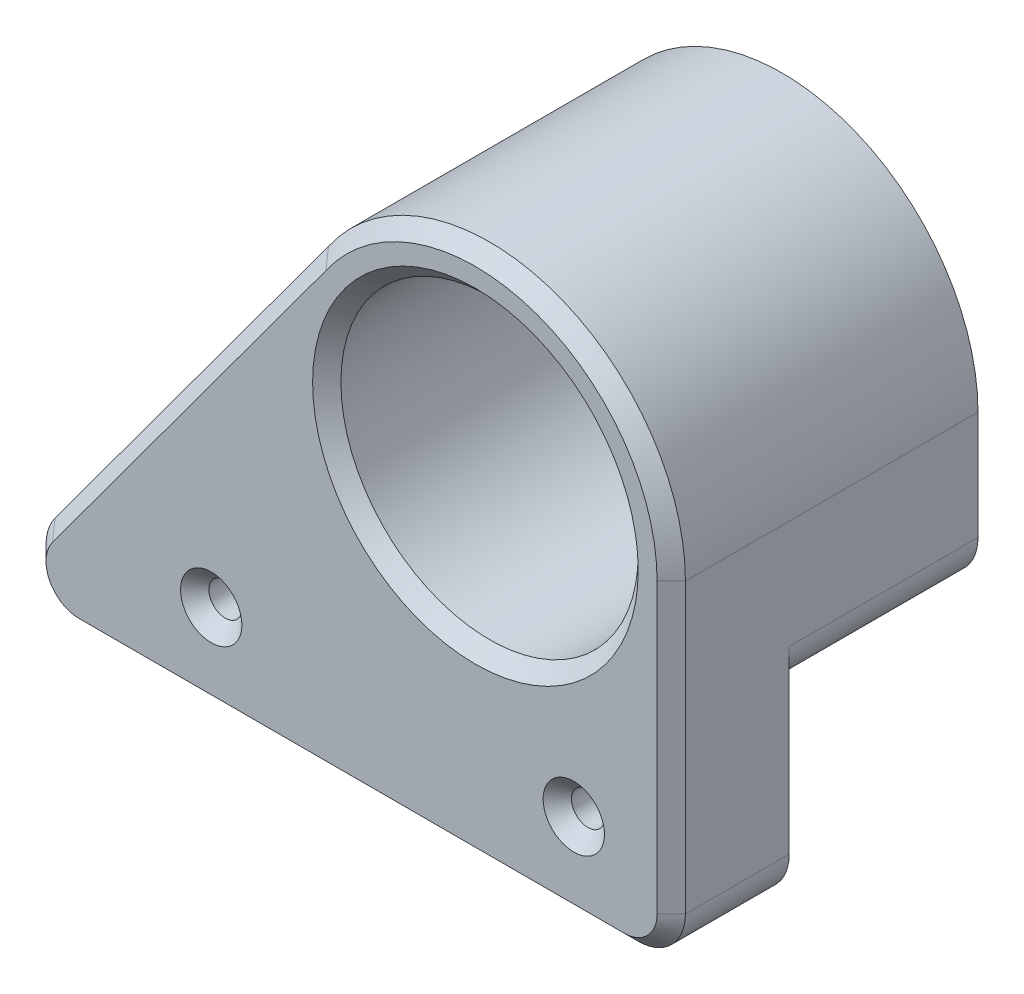
ISO-10303-21;
HEADER;
FILE_DESCRIPTION(('STEP AP214'),'2;1');
FILE_NAME('part.step','',(''),(''),'','','');
FILE_SCHEMA(('AUTOMOTIVE_DESIGN { 1 0 10303 214 1 1 1 1 }'));
ENDSEC;
DATA;
#1=APPLICATION_CONTEXT('core data for automotive mechanical design processes');
#2=APPLICATION_PROTOCOL_DEFINITION('international standard','automotive_design',2000,#1);
#3=PRODUCT_CONTEXT('',#1,'mechanical');
#4=PRODUCT('Part','Part','',(#3));
#5=PRODUCT_RELATED_PRODUCT_CATEGORY('part','',(#4));
#6=PRODUCT_DEFINITION_FORMATION('','',#4);
#7=PRODUCT_DEFINITION_CONTEXT('part definition',#1,'design');
#8=PRODUCT_DEFINITION('design','',#6,#7);
#9=PRODUCT_DEFINITION_SHAPE('','',#8);
#10=(LENGTH_UNIT() NAMED_UNIT(*) SI_UNIT(.MILLI.,.METRE.));
#11=(NAMED_UNIT(*) PLANE_ANGLE_UNIT() SI_UNIT($,.RADIAN.));
#12=(NAMED_UNIT(*) SI_UNIT($,.STERADIAN.) SOLID_ANGLE_UNIT());
#13=UNCERTAINTY_MEASURE_WITH_UNIT(LENGTH_MEASURE(1.E-05),#10,'distance_accuracy_value','');
#14=(GEOMETRIC_REPRESENTATION_CONTEXT(3) GLOBAL_UNCERTAINTY_ASSIGNED_CONTEXT((#13)) GLOBAL_UNIT_ASSIGNED_CONTEXT((#10,
#11,#12)) REPRESENTATION_CONTEXT('',''));
#15=CARTESIAN_POINT('',(0.,0.,0.));
#16=DIRECTION('',(0.,0.,1.));
#17=DIRECTION('',(1.,0.,0.));
#18=AXIS2_PLACEMENT_3D('',#15,#16,#17);
#19=CARTESIAN_POINT('',(0.,0.,0.));
#20=DIRECTION('',(0.,0.,1.));
#21=DIRECTION('',(1.,0.,0.));
#22=AXIS2_PLACEMENT_3D('',#19,#20,#21);
#23=PLANE('',#22);
#24=CARTESIAN_POINT('',(199.016746883648,-11.05,0.));
#25=DIRECTION('',(0.,0.,-1.));
#26=DIRECTION('',(-1.,0.,0.));
#27=AXIS2_PLACEMENT_3D('',#24,#25,#26);
#28=CIRCLE('',#27,3.49999999999999);
#29=CARTESIAN_POINT('',(195.516746883648,-11.05,0.));
#30=VERTEX_POINT('',#29);
#31=EDGE_CURVE('E401',#30,#30,#28,.T.);
#32=ORIENTED_EDGE('',*,*,#31,.F.);
#33=EDGE_LOOP('',(#32));
#34=FACE_BOUND('',#33,.T.);
#35=CARTESIAN_POINT('',(275.852245163691,-11.05,0.));
#36=DIRECTION('',(0.,0.,-1.));
#37=DIRECTION('',(-1.,0.,0.));
#38=AXIS2_PLACEMENT_3D('',#35,#36,#37);
#39=CIRCLE('',#38,3.50000000000002);
#40=CARTESIAN_POINT('',(272.352245163691,-11.05,0.));
#41=VERTEX_POINT('',#40);
#42=EDGE_CURVE('E377',#41,#41,#39,.T.);
#43=ORIENTED_EDGE('',*,*,#42,.F.);
#44=EDGE_LOOP('',(#43));
#45=FACE_BOUND('',#44,.T.);
#46=DIRECTION('',(0.,-1.,0.));
#47=VECTOR('',#46,1.);
#48=CARTESIAN_POINT('',(296.50000002308,0.,0.));
#49=LINE('',#48,#47);
#50=CARTESIAN_POINT('',(296.50000002308,18.,0.));
#51=VERTEX_POINT('',#50);
#52=CARTESIAN_POINT('',(296.50000002308,-20.1,0.));
#53=VERTEX_POINT('',#52);
#54=EDGE_CURVE('E171',#51,#53,#49,.T.);
#55=ORIENTED_EDGE('',*,*,#54,.T.);
#56=CARTESIAN_POINT('',(286.50000002308,-20.1,0.));
#57=DIRECTION('',(0.,0.,1.));
#58=DIRECTION('',(1.,0.,0.));
#59=AXIS2_PLACEMENT_3D('',#56,#57,#58);
#60=CIRCLE('',#59,10.);
#61=CARTESIAN_POINT('',(286.50000002308,-30.1,0.));
#62=VERTEX_POINT('',#61);
#63=EDGE_CURVE('E200',#53,#62,#60,.F.);
#64=ORIENTED_EDGE('',*,*,#63,.T.);
#65=DIRECTION('',(1.,0.,0.));
#66=VECTOR('',#65,1.);
#67=CARTESIAN_POINT('',(286.50000002308,-30.1,0.));
#68=LINE('',#67,#66);
#69=CARTESIAN_POINT('',(171.007463238371,-30.1,0.));
#70=VERTEX_POINT('',#69);
#71=EDGE_CURVE('E400',#70,#62,#68,.T.);
#72=ORIENTED_EDGE('',*,*,#71,.F.);
#73=CARTESIAN_POINT('',(171.007463238371,-20.1,0.));
#74=DIRECTION('',(0.,0.,1.));
#75=DIRECTION('',(1.,0.,0.));
#76=AXIS2_PLACEMENT_3D('',#73,#74,#75);
#77=CIRCLE('',#76,10.);
#78=CARTESIAN_POINT('',(162.950405897241,-14.1768397791605,0.));
#79=VERTEX_POINT('',#78);
#80=EDGE_CURVE('E198',#70,#79,#77,.F.);
#81=ORIENTED_EDGE('',*,*,#80,.T.);
#82=DIRECTION('',(-0.592316022083946,-0.805705734113052,0.));
#83=VECTOR('',#82,1.);
#84=CARTESIAN_POINT('',(112.546814884176,-82.7389937391953,0.));
#85=LINE('',#84,#83);
#86=CARTESIAN_POINT('',(190.959689542517,23.9231602208395,0.));
#87=VERTEX_POINT('',#86);
#88=EDGE_CURVE('E175',#87,#79,#85,.T.);
#89=ORIENTED_EDGE('',*,*,#88,.F.);
#90=CARTESIAN_POINT('',(199.016746883648,18.,0.));
#91=DIRECTION('',(0.,0.,1.));
#92=DIRECTION('',(1.,0.,0.));
#93=AXIS2_PLACEMENT_3D('',#90,#91,#92);
#94=CIRCLE('',#93,10.);
#95=CARTESIAN_POINT('',(199.016746883648,8.,0.));
#96=VERTEX_POINT('',#95);
#97=EDGE_CURVE('E194',#87,#96,#94,.T.);
#98=ORIENTED_EDGE('',*,*,#97,.T.);
#99=DIRECTION('',(-1.,0.,0.));
#100=VECTOR('',#99,1.);
#101=CARTESIAN_POINT('',(296.50000002308,8.,0.));
#102=LINE('',#101,#100);
#103=CARTESIAN_POINT('',(286.50000002308,8.,0.));
#104=VERTEX_POINT('',#103);
#105=EDGE_CURVE('E161',#104,#96,#102,.T.);
#106=ORIENTED_EDGE('',*,*,#105,.F.);
#107=CARTESIAN_POINT('',(286.50000002308,18.,0.));
#108=DIRECTION('',(0.,0.,1.));
#109=DIRECTION('',(1.,0.,0.));
#110=AXIS2_PLACEMENT_3D('',#107,#108,#109);
#111=CIRCLE('',#110,10.);
#112=EDGE_CURVE('E191',#104,#51,#111,.T.);
#113=ORIENTED_EDGE('',*,*,#112,.T.);
#114=EDGE_LOOP('',(#55,#64,#72,#81,#89,#98,#106,#113));
#115=FACE_BOUND('',#114,.T.);
#116=ADVANCED_FACE('F37',(#34,#45,#115),#23,.F.);
#117=CARTESIAN_POINT('',(296.50000002308,0.,25.));
#118=DIRECTION('',(1.,0.,0.));
#119=DIRECTION('',(0.,0.,-1.));
#120=AXIS2_PLACEMENT_3D('',#117,#118,#119);
#121=PLANE('',#120);
#122=DIRECTION('',(0.,0.,-1.));
#123=VECTOR('',#122,1.);
#124=CARTESIAN_POINT('',(296.50000002308,40.9999999724445,25.));
#125=LINE('',#124,#123);
#126=CARTESIAN_POINT('',(296.50000002308,40.9999999724445,22.));
#127=VERTEX_POINT('',#126);
#128=CARTESIAN_POINT('',(296.50000002308,40.9999999724445,-40.));
#129=VERTEX_POINT('',#128);
#130=EDGE_CURVE('E136',#127,#129,#125,.T.);
#131=ORIENTED_EDGE('',*,*,#130,.F.);
#132=DIRECTION('',(0.,-1.,0.));
#133=VECTOR('',#132,1.);
#134=CARTESIAN_POINT('',(296.50000002308,0.,22.));
#135=LINE('',#134,#133);
#136=CARTESIAN_POINT('',(296.50000002308,-20.1,22.));
#137=VERTEX_POINT('',#136);
#138=EDGE_CURVE('E63',#127,#137,#135,.T.);
#139=ORIENTED_EDGE('',*,*,#138,.T.);
#140=DIRECTION('',(0.,0.,-1.));
#141=VECTOR('',#140,1.);
#142=CARTESIAN_POINT('',(296.50000002308,-20.1,0.));
#143=LINE('',#142,#141);
#144=EDGE_CURVE('E196',#137,#53,#143,.T.);
#145=ORIENTED_EDGE('',*,*,#144,.T.);
#146=ORIENTED_EDGE('',*,*,#54,.F.);
#147=DIRECTION('',(0.,0.,1.));
#148=VECTOR('',#147,1.);
#149=CARTESIAN_POINT('',(296.50000002308,18.,-40.));
#150=LINE('',#149,#148);
#151=CARTESIAN_POINT('',(296.50000002308,18.,-40.));
#152=VERTEX_POINT('',#151);
#153=EDGE_CURVE('E151',#51,#152,#150,.F.);
#154=ORIENTED_EDGE('',*,*,#153,.T.);
#155=DIRECTION('',(0.,-1.,0.));
#156=VECTOR('',#155,1.);
#157=CARTESIAN_POINT('',(296.50000002308,40.9999999724445,-40.));
#158=LINE('',#157,#156);
#159=EDGE_CURVE('E148',#129,#152,#158,.T.);
#160=ORIENTED_EDGE('',*,*,#159,.F.);
#161=EDGE_LOOP('',(#131,#139,#145,#146,#154,#160));
#162=FACE_BOUND('',#161,.T.);
#163=ADVANCED_FACE('F149',(#162),#121,.T.);
#164=CARTESIAN_POINT('',(255.00000002308,40.9999999724445,25.));
#165=DIRECTION('',(0.,0.,-1.));
#166=DIRECTION('',(-1.,0.,0.));
#167=AXIS2_PLACEMENT_3D('',#164,#165,#166);
#168=CYLINDRICAL_SURFACE('',#167,41.5);
#169=DIRECTION('',(0.,0.,-1.));
#170=VECTOR('',#169,1.);
#171=CARTESIAN_POINT('',(220.868632913382,64.6071975872188,25.));
#172=LINE('',#171,#170);
#173=CARTESIAN_POINT('',(220.868632913382,64.6071975872188,22.));
#174=VERTEX_POINT('',#173);
#175=CARTESIAN_POINT('',(220.868632913382,64.6071975872188,-40.));
#176=VERTEX_POINT('',#175);
#177=EDGE_CURVE('E145',#174,#176,#172,.T.);
#178=ORIENTED_EDGE('',*,*,#177,.F.);
#179=CARTESIAN_POINT('',(255.00000002308,40.9999999724445,22.));
#180=DIRECTION('',(0.,0.,1.));
#181=DIRECTION('',(1.,0.,0.));
#182=AXIS2_PLACEMENT_3D('',#179,#180,#181);
#183=CIRCLE('',#182,41.5);
#184=EDGE_CURVE('E143',#174,#127,#183,.F.);
#185=ORIENTED_EDGE('',*,*,#184,.T.);
#186=ORIENTED_EDGE('',*,*,#130,.T.);
#187=CARTESIAN_POINT('',(255.00000002308,40.9999999724445,-40.));
#188=DIRECTION('',(0.,0.,-1.));
#189=DIRECTION('',(-1.,0.,0.));
#190=AXIS2_PLACEMENT_3D('',#187,#188,#189);
#191=CIRCLE('',#190,41.5);
#192=EDGE_CURVE('E141',#176,#129,#191,.T.);
#193=ORIENTED_EDGE('',*,*,#192,.F.);
#194=EDGE_LOOP('',(#178,#185,#186,#193));
#195=FACE_BOUND('',#194,.T.);
#196=ADVANCED_FACE('F139',(#195),#168,.T.);
#197=CARTESIAN_POINT('',(112.546814884176,-82.7389937391953,25.));
#198=DIRECTION('',(0.805705734113051,-0.592316022083945,0.));
#199=DIRECTION('',(0.592316022083945,0.805705734113052,0.));
#200=AXIS2_PLACEMENT_3D('',#197,#198,#199);
#201=PLANE('',#200);
#202=DIRECTION('',(0.,0.,-1.));
#203=VECTOR('',#202,1.);
#204=CARTESIAN_POINT('',(162.950405897241,-14.1768397791605,25.));
#205=LINE('',#204,#203);
#206=CARTESIAN_POINT('',(162.950405897241,-14.1768397791605,22.));
#207=VERTEX_POINT('',#206);
#208=EDGE_CURVE('E206',#79,#207,#205,.F.);
#209=ORIENTED_EDGE('',*,*,#208,.T.);
#210=DIRECTION('',(0.592316022083945,0.805705734113052,0.));
#211=VECTOR('',#210,1.);
#212=CARTESIAN_POINT('',(220.868632913382,64.6071975872188,22.));
#213=LINE('',#212,#211);
#214=EDGE_CURVE('E237',#207,#174,#213,.T.);
#215=ORIENTED_EDGE('',*,*,#214,.T.);
#216=ORIENTED_EDGE('',*,*,#177,.T.);
#217=DIRECTION('',(0.592316022083946,0.805705734113051,0.));
#218=VECTOR('',#217,1.);
#219=CARTESIAN_POINT('',(220.868632913382,64.6071975872188,-40.));
#220=LINE('',#219,#218);
#221=CARTESIAN_POINT('',(190.959689542517,23.9231602208395,-40.));
#222=VERTEX_POINT('',#221);
#223=EDGE_CURVE('E160',#222,#176,#220,.T.);
#224=ORIENTED_EDGE('',*,*,#223,.F.);
#225=DIRECTION('',(0.,0.,1.));
#226=VECTOR('',#225,1.);
#227=CARTESIAN_POINT('',(190.959689542517,23.9231602208395,25.));
#228=LINE('',#227,#226);
#229=EDGE_CURVE('E188',#222,#87,#228,.T.);
#230=ORIENTED_EDGE('',*,*,#229,.T.);
#231=ORIENTED_EDGE('',*,*,#88,.T.);
#232=EDGE_LOOP('',(#209,#215,#216,#224,#230,#231));
#233=FACE_BOUND('',#232,.T.);
#234=ADVANCED_FACE('F323',(#233),#201,.F.);
#235=CARTESIAN_POINT('',(255.00000002308,40.9999999724445,25.));
#236=DIRECTION('',(0.,0.,-1.));
#237=DIRECTION('',(-1.,0.,0.));
#238=AXIS2_PLACEMENT_3D('',#235,#236,#237);
#239=CYLINDRICAL_SURFACE('',#238,31.5);
#240=CARTESIAN_POINT('',(255.00000002308,40.9999999724445,22.));
#241=DIRECTION('',(0.,0.,1.));
#242=DIRECTION('',(1.,0.,0.));
#243=AXIS2_PLACEMENT_3D('',#240,#241,#242);
#244=CIRCLE('',#243,31.5);
#245=CARTESIAN_POINT('',(286.50000002308,40.9999999724445,22.));
#246=VERTEX_POINT('',#245);
#247=EDGE_CURVE('E209',#246,#246,#244,.T.);
#248=ORIENTED_EDGE('',*,*,#247,.T.);
#249=EDGE_LOOP('',(#248));
#250=FACE_BOUND('',#249,.T.);
#251=CARTESIAN_POINT('',(255.00000002308,40.9999999724445,-40.));
#252=DIRECTION('',(0.,0.,-1.));
#253=DIRECTION('',(-1.,0.,0.));
#254=AXIS2_PLACEMENT_3D('',#251,#252,#253);
#255=CIRCLE('',#254,31.5000000000001);
#256=CARTESIAN_POINT('',(223.50000002308,40.9999999724445,-40.));
#257=VERTEX_POINT('',#256);
#258=EDGE_CURVE('E164',#257,#257,#255,.T.);
#259=ORIENTED_EDGE('',*,*,#258,.T.);
#260=EDGE_LOOP('',(#259));
#261=FACE_BOUND('',#260,.T.);
#262=ADVANCED_FACE('F320',(#250,#261),#239,.F.);
#263=CARTESIAN_POINT('',(0.,0.,25.));
#264=DIRECTION('',(0.,0.,1.));
#265=DIRECTION('',(1.,0.,0.));
#266=AXIS2_PLACEMENT_3D('',#263,#264,#265);
#267=PLANE('',#266);
#268=CARTESIAN_POINT('',(255.00000002308,40.9999999724445,25.));
#269=DIRECTION('',(0.,0.,1.));
#270=DIRECTION('',(1.,0.,0.));
#271=AXIS2_PLACEMENT_3D('',#268,#269,#270);
#272=CIRCLE('',#271,34.5);
#273=CARTESIAN_POINT('',(289.50000002308,40.9999999724445,25.));
#274=VERTEX_POINT('',#273);
#275=EDGE_CURVE('E231',#274,#274,#272,.F.);
#276=ORIENTED_EDGE('',*,*,#275,.T.);
#277=EDGE_LOOP('',(#276));
#278=FACE_BOUND('',#277,.T.);
#279=DIRECTION('',(-0.592316022083946,-0.805705734113052,0.));
#280=VECTOR('',#279,1.);
#281=CARTESIAN_POINT('',(165.36752309958,-15.9537878454124,25.));
#282=LINE('',#281,#280);
#283=CARTESIAN_POINT('',(223.311843289943,62.8657431076805,25.));
#284=VERTEX_POINT('',#283);
#285=CARTESIAN_POINT('',(165.36752309958,-15.9537878454124,25.));
#286=VERTEX_POINT('',#285);
#287=EDGE_CURVE('E226',#284,#286,#282,.T.);
#288=ORIENTED_EDGE('',*,*,#287,.T.);
#289=CARTESIAN_POINT('',(171.007463238371,-20.1,25.));
#290=DIRECTION('',(0.,0.,1.));
#291=DIRECTION('',(1.,0.,0.));
#292=AXIS2_PLACEMENT_3D('',#289,#290,#291);
#293=CIRCLE('',#292,6.99999999999999);
#294=CARTESIAN_POINT('',(171.007463238371,-27.1,25.));
#295=VERTEX_POINT('',#294);
#296=EDGE_CURVE('E228',#286,#295,#293,.T.);
#297=ORIENTED_EDGE('',*,*,#296,.T.);
#298=DIRECTION('',(1.,0.,0.));
#299=VECTOR('',#298,1.);
#300=CARTESIAN_POINT('',(286.50000002308,-27.1,25.));
#301=LINE('',#300,#299);
#302=CARTESIAN_POINT('',(286.50000002308,-27.1,25.));
#303=VERTEX_POINT('',#302);
#304=EDGE_CURVE('E218',#295,#303,#301,.T.);
#305=ORIENTED_EDGE('',*,*,#304,.T.);
#306=CARTESIAN_POINT('',(286.50000002308,-20.1,25.));
#307=DIRECTION('',(0.,0.,1.));
#308=DIRECTION('',(1.,0.,0.));
#309=AXIS2_PLACEMENT_3D('',#306,#307,#308);
#310=CIRCLE('',#309,7.00000000000001);
#311=CARTESIAN_POINT('',(293.50000002308,-20.1,25.));
#312=VERTEX_POINT('',#311);
#313=EDGE_CURVE('E220',#303,#312,#310,.T.);
#314=ORIENTED_EDGE('',*,*,#313,.T.);
#315=DIRECTION('',(0.,1.,0.));
#316=VECTOR('',#315,1.);
#317=CARTESIAN_POINT('',(293.50000002308,0.,25.));
#318=LINE('',#317,#316);
#319=CARTESIAN_POINT('',(293.50000002308,40.9999999724445,25.));
#320=VERTEX_POINT('',#319);
#321=EDGE_CURVE('E222',#312,#320,#318,.T.);
#322=ORIENTED_EDGE('',*,*,#321,.T.);
#323=CARTESIAN_POINT('',(255.00000002308,40.9999999724445,25.));
#324=DIRECTION('',(0.,0.,1.));
#325=DIRECTION('',(1.,0.,0.));
#326=AXIS2_PLACEMENT_3D('',#323,#324,#325);
#327=CIRCLE('',#326,38.5);
#328=EDGE_CURVE('E224',#320,#284,#327,.T.);
#329=ORIENTED_EDGE('',*,*,#328,.T.);
#330=EDGE_LOOP('',(#288,#297,#305,#314,#322,#329));
#331=FACE_BOUND('',#330,.T.);
#332=CARTESIAN_POINT('',(275.852245163691,-11.05,25.));
#333=DIRECTION('',(0.,0.,1.));
#334=DIRECTION('',(1.,0.,0.));
#335=AXIS2_PLACEMENT_3D('',#332,#333,#334);
#336=CIRCLE('',#335,6.50000000000001);
#337=CARTESIAN_POINT('',(282.352245163691,-11.05,25.));
#338=VERTEX_POINT('',#337);
#339=EDGE_CURVE('E215',#338,#338,#336,.F.);
#340=ORIENTED_EDGE('',*,*,#339,.T.);
#341=EDGE_LOOP('',(#340));
#342=FACE_BOUND('',#341,.T.);
#343=CARTESIAN_POINT('',(199.016746883648,-11.05,25.));
#344=DIRECTION('',(0.,0.,1.));
#345=DIRECTION('',(1.,0.,0.));
#346=AXIS2_PLACEMENT_3D('',#343,#344,#345);
#347=CIRCLE('',#346,6.50000000000001);
#348=CARTESIAN_POINT('',(205.516746883648,-11.05,25.));
#349=VERTEX_POINT('',#348);
#350=EDGE_CURVE('E212',#349,#349,#347,.F.);
#351=ORIENTED_EDGE('',*,*,#350,.T.);
#352=EDGE_LOOP('',(#351));
#353=FACE_BOUND('',#352,.T.);
#354=ADVANCED_FACE('F318',(#278,#331,#342,#353),#267,.T.);
#355=CARTESIAN_POINT('',(255.00000002308,40.9999999724445,-40.));
#356=DIRECTION('',(0.,0.,-1.));
#357=DIRECTION('',(-1.,0.,0.));
#358=AXIS2_PLACEMENT_3D('',#355,#356,#357);
#359=PLANE('',#358);
#360=ORIENTED_EDGE('',*,*,#159,.T.);
#361=CARTESIAN_POINT('',(286.50000002308,18.,-40.));
#362=DIRECTION('',(0.,0.,-1.));
#363=DIRECTION('',(-1.,0.,0.));
#364=AXIS2_PLACEMENT_3D('',#361,#362,#363);
#365=CIRCLE('',#364,10.);
#366=CARTESIAN_POINT('',(286.50000002308,8.,-40.));
#367=VERTEX_POINT('',#366);
#368=EDGE_CURVE('E186',#152,#367,#365,.T.);
#369=ORIENTED_EDGE('',*,*,#368,.T.);
#370=DIRECTION('',(-1.,0.,0.));
#371=VECTOR('',#370,1.);
#372=CARTESIAN_POINT('',(296.50000002308,8.,-40.));
#373=LINE('',#372,#371);
#374=CARTESIAN_POINT('',(199.016746883648,8.,-40.));
#375=VERTEX_POINT('',#374);
#376=EDGE_CURVE('E154',#367,#375,#373,.T.);
#377=ORIENTED_EDGE('',*,*,#376,.T.);
#378=CARTESIAN_POINT('',(199.016746883648,18.,-40.));
#379=DIRECTION('',(0.,0.,-1.));
#380=DIRECTION('',(-1.,0.,0.));
#381=AXIS2_PLACEMENT_3D('',#378,#379,#380);
#382=CIRCLE('',#381,10.);
#383=EDGE_CURVE('E184',#375,#222,#382,.T.);
#384=ORIENTED_EDGE('',*,*,#383,.T.);
#385=ORIENTED_EDGE('',*,*,#223,.T.);
#386=ORIENTED_EDGE('',*,*,#192,.T.);
#387=EDGE_LOOP('',(#360,#369,#377,#384,#385,#386));
#388=FACE_BOUND('',#387,.T.);
#389=ORIENTED_EDGE('',*,*,#258,.F.);
#390=EDGE_LOOP('',(#389));
#391=FACE_BOUND('',#390,.T.);
#392=ADVANCED_FACE('F157',(#388,#391),#359,.T.);
#393=CARTESIAN_POINT('',(296.50000002308,8.,-40.));
#394=DIRECTION('',(0.,1.,0.));
#395=DIRECTION('',(0.,0.,1.));
#396=AXIS2_PLACEMENT_3D('',#393,#394,#395);
#397=PLANE('',#396);
#398=ORIENTED_EDGE('',*,*,#376,.F.);
#399=DIRECTION('',(0.,0.,1.));
#400=VECTOR('',#399,1.);
#401=CARTESIAN_POINT('',(286.50000002308,8.,0.));
#402=LINE('',#401,#400);
#403=EDGE_CURVE('E180',#367,#104,#402,.T.);
#404=ORIENTED_EDGE('',*,*,#403,.T.);
#405=ORIENTED_EDGE('',*,*,#105,.T.);
#406=DIRECTION('',(0.,0.,1.));
#407=VECTOR('',#406,1.);
#408=CARTESIAN_POINT('',(199.016746883648,8.,-40.));
#409=LINE('',#408,#407);
#410=EDGE_CURVE('E144',#96,#375,#409,.F.);
#411=ORIENTED_EDGE('',*,*,#410,.T.);
#412=EDGE_LOOP('',(#398,#404,#405,#411));
#413=FACE_BOUND('',#412,.T.);
#414=ADVANCED_FACE('F334',(#413),#397,.F.);
#415=CARTESIAN_POINT('',(286.50000002308,18.,-40.));
#416=DIRECTION('',(0.,0.,-1.));
#417=DIRECTION('',(-1.,0.,0.));
#418=AXIS2_PLACEMENT_3D('',#415,#416,#417);
#419=CYLINDRICAL_SURFACE('',#418,10.);
#420=ORIENTED_EDGE('',*,*,#368,.F.);
#421=ORIENTED_EDGE('',*,*,#153,.F.);
#422=ORIENTED_EDGE('',*,*,#112,.F.);
#423=ORIENTED_EDGE('',*,*,#403,.F.);
#424=EDGE_LOOP('',(#420,#421,#422,#423));
#425=FACE_BOUND('',#424,.T.);
#426=ADVANCED_FACE('F330',(#425),#419,.T.);
#427=CARTESIAN_POINT('',(199.016746883648,18.,25.));
#428=DIRECTION('',(0.,0.,1.));
#429=DIRECTION('',(1.,0.,0.));
#430=AXIS2_PLACEMENT_3D('',#427,#428,#429);
#431=CYLINDRICAL_SURFACE('',#430,10.);
#432=ORIENTED_EDGE('',*,*,#383,.F.);
#433=ORIENTED_EDGE('',*,*,#410,.F.);
#434=ORIENTED_EDGE('',*,*,#97,.F.);
#435=ORIENTED_EDGE('',*,*,#229,.F.);
#436=EDGE_LOOP('',(#432,#433,#434,#435));
#437=FACE_BOUND('',#436,.T.);
#438=ADVANCED_FACE('F333',(#437),#431,.T.);
#439=CARTESIAN_POINT('',(286.50000002308,-30.1,25.));
#440=DIRECTION('',(0.,1.,0.));
#441=DIRECTION('',(0.,0.,1.));
#442=AXIS2_PLACEMENT_3D('',#439,#440,#441);
#443=PLANE('',#442);
#444=DIRECTION('',(0.,0.,-1.));
#445=VECTOR('',#444,1.);
#446=CARTESIAN_POINT('',(286.50000002308,-30.1,25.));
#447=LINE('',#446,#445);
#448=CARTESIAN_POINT('',(286.50000002308,-30.1,22.));
#449=VERTEX_POINT('',#448);
#450=EDGE_CURVE('E204',#62,#449,#447,.F.);
#451=ORIENTED_EDGE('',*,*,#450,.T.);
#452=DIRECTION('',(-1.,0.,0.));
#453=VECTOR('',#452,1.);
#454=CARTESIAN_POINT('',(171.007463238371,-30.1,22.));
#455=LINE('',#454,#453);
#456=CARTESIAN_POINT('',(171.007463238371,-30.1,22.));
#457=VERTEX_POINT('',#456);
#458=EDGE_CURVE('E242',#449,#457,#455,.T.);
#459=ORIENTED_EDGE('',*,*,#458,.T.);
#460=DIRECTION('',(0.,0.,-1.));
#461=VECTOR('',#460,1.);
#462=CARTESIAN_POINT('',(171.007463238371,-30.1,25.));
#463=LINE('',#462,#461);
#464=EDGE_CURVE('E202',#457,#70,#463,.T.);
#465=ORIENTED_EDGE('',*,*,#464,.T.);
#466=ORIENTED_EDGE('',*,*,#71,.T.);
#467=EDGE_LOOP('',(#451,#459,#465,#466));
#468=FACE_BOUND('',#467,.T.);
#469=ADVANCED_FACE('F338',(#468),#443,.F.);
#470=CARTESIAN_POINT('',(286.50000002308,-20.1,25.));
#471=DIRECTION('',(0.,0.,1.));
#472=DIRECTION('',(1.,0.,0.));
#473=AXIS2_PLACEMENT_3D('',#470,#471,#472);
#474=CYLINDRICAL_SURFACE('',#473,10.);
#475=ORIENTED_EDGE('',*,*,#144,.F.);
#476=CARTESIAN_POINT('',(286.50000002308,-20.1,22.));
#477=DIRECTION('',(0.,0.,1.));
#478=DIRECTION('',(1.,0.,0.));
#479=AXIS2_PLACEMENT_3D('',#476,#477,#478);
#480=CIRCLE('',#479,10.);
#481=EDGE_CURVE('E55',#137,#449,#480,.F.);
#482=ORIENTED_EDGE('',*,*,#481,.T.);
#483=ORIENTED_EDGE('',*,*,#450,.F.);
#484=ORIENTED_EDGE('',*,*,#63,.F.);
#485=EDGE_LOOP('',(#475,#482,#483,#484));
#486=FACE_BOUND('',#485,.T.);
#487=ADVANCED_FACE('F340',(#486),#474,.T.);
#488=CARTESIAN_POINT('',(171.007463238371,-20.1,25.));
#489=DIRECTION('',(0.,0.,-1.));
#490=DIRECTION('',(-1.,0.,0.));
#491=AXIS2_PLACEMENT_3D('',#488,#489,#490);
#492=CYLINDRICAL_SURFACE('',#491,10.);
#493=ORIENTED_EDGE('',*,*,#464,.F.);
#494=CARTESIAN_POINT('',(171.007463238371,-20.1,22.));
#495=DIRECTION('',(0.,0.,1.));
#496=DIRECTION('',(1.,0.,0.));
#497=AXIS2_PLACEMENT_3D('',#494,#495,#496);
#498=CIRCLE('',#497,10.);
#499=EDGE_CURVE('E234',#457,#207,#498,.F.);
#500=ORIENTED_EDGE('',*,*,#499,.T.);
#501=ORIENTED_EDGE('',*,*,#208,.F.);
#502=ORIENTED_EDGE('',*,*,#80,.F.);
#503=EDGE_LOOP('',(#493,#500,#501,#502));
#504=FACE_BOUND('',#503,.T.);
#505=ADVANCED_FACE('F343',(#504),#492,.T.);
#506=CARTESIAN_POINT('',(275.852245163691,-11.05,25.));
#507=DIRECTION('',(0.,0.,-1.));
#508=DIRECTION('',(-1.,0.,0.));
#509=AXIS2_PLACEMENT_3D('',#506,#507,#508);
#510=CYLINDRICAL_SURFACE('',#509,3.50000000000002);
#511=CARTESIAN_POINT('',(275.852245163691,-11.05,22.));
#512=DIRECTION('',(0.,0.,1.));
#513=DIRECTION('',(1.,0.,0.));
#514=AXIS2_PLACEMENT_3D('',#511,#512,#513);
#515=CIRCLE('',#514,3.50000000000002);
#516=CARTESIAN_POINT('',(279.352245163691,-11.05,22.));
#517=VERTEX_POINT('',#516);
#518=EDGE_CURVE('E47',#517,#517,#515,.T.);
#519=ORIENTED_EDGE('',*,*,#518,.T.);
#520=EDGE_LOOP('',(#519));
#521=FACE_BOUND('',#520,.T.);
#522=ORIENTED_EDGE('',*,*,#42,.T.);
#523=EDGE_LOOP('',(#522));
#524=FACE_BOUND('',#523,.T.);
#525=ADVANCED_FACE('F346',(#521,#524),#510,.F.);
#526=CARTESIAN_POINT('',(199.016746883648,-11.05,25.));
#527=DIRECTION('',(0.,0.,-1.));
#528=DIRECTION('',(-1.,0.,0.));
#529=AXIS2_PLACEMENT_3D('',#526,#527,#528);
#530=CYLINDRICAL_SURFACE('',#529,3.49999999999999);
#531=CARTESIAN_POINT('',(199.016746883648,-11.05,22.));
#532=DIRECTION('',(0.,0.,1.));
#533=DIRECTION('',(1.,0.,0.));
#534=AXIS2_PLACEMENT_3D('',#531,#532,#533);
#535=CIRCLE('',#534,3.49999999999999);
#536=CARTESIAN_POINT('',(202.516746883648,-11.05,22.));
#537=VERTEX_POINT('',#536);
#538=EDGE_CURVE('E11',#537,#537,#535,.T.);
#539=ORIENTED_EDGE('',*,*,#538,.T.);
#540=EDGE_LOOP('',(#539));
#541=FACE_BOUND('',#540,.T.);
#542=ORIENTED_EDGE('',*,*,#31,.T.);
#543=EDGE_LOOP('',(#542));
#544=FACE_BOUND('',#543,.T.);
#545=ADVANCED_FACE('F351',(#541,#544),#530,.F.);
#546=CARTESIAN_POINT('',(255.00000002308,40.9999999724445,22.));
#547=DIRECTION('',(0.,0.,1.));
#548=DIRECTION('',(1.,0.,0.));
#549=AXIS2_PLACEMENT_3D('',#546,#547,#548);
#550=CONICAL_SURFACE('',#549,31.5,0.785398163397449);
#551=ORIENTED_EDGE('',*,*,#275,.F.);
#552=EDGE_LOOP('',(#551));
#553=FACE_BOUND('',#552,.T.);
#554=ORIENTED_EDGE('',*,*,#247,.F.);
#555=EDGE_LOOP('',(#554));
#556=FACE_BOUND('',#555,.T.);
#557=ADVANCED_FACE('F287',(#553,#556),#550,.F.);
#558=CARTESIAN_POINT('',(296.50000002308,0.,22.));
#559=DIRECTION('',(-0.707106781186551,0.,-0.707106781186544));
#560=DIRECTION('',(0.,-1.,0.));
#561=AXIS2_PLACEMENT_3D('',#558,#559,#560);
#562=PLANE('',#561);
#563=DIRECTION('',(-0.707106781186544,0.,0.707106781186551));
#564=VECTOR('',#563,1.);
#565=CARTESIAN_POINT('',(296.50000002308,-20.1,22.));
#566=LINE('',#565,#564);
#567=EDGE_CURVE('E261',#137,#312,#566,.T.);
#568=ORIENTED_EDGE('',*,*,#567,.F.);
#569=ORIENTED_EDGE('',*,*,#138,.F.);
#570=DIRECTION('',(0.707106781186544,0.,-0.707106781186551));
#571=VECTOR('',#570,1.);
#572=CARTESIAN_POINT('',(293.50000002308,40.9999999724445,25.));
#573=LINE('',#572,#571);
#574=EDGE_CURVE('E42',#320,#127,#573,.T.);
#575=ORIENTED_EDGE('',*,*,#574,.F.);
#576=ORIENTED_EDGE('',*,*,#321,.F.);
#577=EDGE_LOOP('',(#568,#569,#575,#576));
#578=FACE_BOUND('',#577,.T.);
#579=ADVANCED_FACE('F275',(#578),#562,.F.);
#580=CARTESIAN_POINT('',(255.00000002308,40.9999999724445,25.));
#581=DIRECTION('',(0.,0.,-1.));
#582=DIRECTION('',(-1.,0.,0.));
#583=AXIS2_PLACEMENT_3D('',#580,#581,#582);
#584=CONICAL_SURFACE('',#583,38.5,0.785398163397444);
#585=ORIENTED_EDGE('',*,*,#574,.T.);
#586=ORIENTED_EDGE('',*,*,#184,.F.);
#587=CARTESIAN_POINT('',(220.868632913382,64.6071975872188,22.));
#588=CARTESIAN_POINT('',(221.275753878756,64.3168436066587,22.5000010110412));
#589=CARTESIAN_POINT('',(221.682915226084,64.026545409802,23.0000015164728));
#590=CARTESIAN_POINT('',(222.497318684938,63.4460605832893,24.0000015164729));
#591=CARTESIAN_POINT('',(222.904560796464,63.1558739536334,24.5000010110412));
#592=CARTESIAN_POINT('',(223.311843289943,62.8657431076811,25.));
#593=B_SPLINE_CURVE_WITH_KNOTS('',3,(#587,#588,#589,#590,#591,#592),.UNSPECIFIED.,.F.,.F.,(4,2,
4),(0.,2.1214347035894,4.24286940868786),.UNSPECIFIED.);
#594=EDGE_CURVE('E253',#284,#174,#593,.F.);
#595=ORIENTED_EDGE('',*,*,#594,.F.);
#596=ORIENTED_EDGE('',*,*,#328,.F.);
#597=EDGE_LOOP('',(#585,#586,#595,#596));
#598=FACE_BOUND('',#597,.T.);
#599=ADVANCED_FACE('F267',(#598),#584,.T.);
#600=CARTESIAN_POINT('',(286.50000002308,-20.1,25.));
#601=DIRECTION('',(0.,0.,-1.));
#602=DIRECTION('',(-1.,0.,0.));
#603=AXIS2_PLACEMENT_3D('',#600,#601,#602);
#604=CONICAL_SURFACE('',#603,7.,0.785398163397443);
#605=ORIENTED_EDGE('',*,*,#567,.T.);
#606=ORIENTED_EDGE('',*,*,#313,.F.);
#607=DIRECTION('',(0.,0.707106781186543,0.707106781186552));
#608=VECTOR('',#607,1.);
#609=CARTESIAN_POINT('',(286.50000002308,-30.1,22.));
#610=LINE('',#609,#608);
#611=EDGE_CURVE('E250',#449,#303,#610,.T.);
#612=ORIENTED_EDGE('',*,*,#611,.F.);
#613=ORIENTED_EDGE('',*,*,#481,.F.);
#614=EDGE_LOOP('',(#605,#606,#612,#613));
#615=FACE_BOUND('',#614,.T.);
#616=ADVANCED_FACE('F274',(#615),#604,.T.);
#617=CARTESIAN_POINT('',(114.963932086516,-84.5159418054472,25.));
#618=DIRECTION('',(-0.569719988232225,0.418830675820999,0.707106781186547));
#619=DIRECTION('',(0.592316022083945,0.805705734113052,0.));
#620=AXIS2_PLACEMENT_3D('',#617,#618,#619);
#621=PLANE('',#620);
#622=ORIENTED_EDGE('',*,*,#594,.T.);
#623=ORIENTED_EDGE('',*,*,#214,.F.);
#624=DIRECTION('',(-0.569719988232223,0.418830675820997,-0.707106781186549));
#625=VECTOR('',#624,1.);
#626=CARTESIAN_POINT('',(165.36752309958,-15.9537878454124,25.));
#627=LINE('',#626,#625);
#628=EDGE_CURVE('E248',#286,#207,#627,.T.);
#629=ORIENTED_EDGE('',*,*,#628,.F.);
#630=ORIENTED_EDGE('',*,*,#287,.F.);
#631=EDGE_LOOP('',(#622,#623,#629,#630));
#632=FACE_BOUND('',#631,.T.);
#633=ADVANCED_FACE('F263',(#632),#621,.T.);
#634=CARTESIAN_POINT('',(0.,-27.1,25.));
#635=DIRECTION('',(0.,-0.707106781186551,0.707106781186544));
#636=DIRECTION('',(-1.,0.,0.));
#637=AXIS2_PLACEMENT_3D('',#634,#635,#636);
#638=PLANE('',#637);
#639=ORIENTED_EDGE('',*,*,#611,.T.);
#640=ORIENTED_EDGE('',*,*,#304,.F.);
#641=DIRECTION('',(0.,0.707106781186544,0.707106781186551));
#642=VECTOR('',#641,1.);
#643=CARTESIAN_POINT('',(171.007463238371,-30.1,22.));
#644=LINE('',#643,#642);
#645=EDGE_CURVE('E246',#457,#295,#644,.T.);
#646=ORIENTED_EDGE('',*,*,#645,.F.);
#647=ORIENTED_EDGE('',*,*,#458,.F.);
#648=EDGE_LOOP('',(#639,#640,#646,#647));
#649=FACE_BOUND('',#648,.T.);
#650=ADVANCED_FACE('F302',(#649),#638,.T.);
#651=CARTESIAN_POINT('',(171.007463238371,-20.1,25.));
#652=DIRECTION('',(0.,0.,-1.));
#653=DIRECTION('',(-1.,0.,0.));
#654=AXIS2_PLACEMENT_3D('',#651,#652,#653);
#655=CONICAL_SURFACE('',#654,6.99999999999999,0.785398163397444);
#656=ORIENTED_EDGE('',*,*,#628,.T.);
#657=ORIENTED_EDGE('',*,*,#499,.F.);
#658=ORIENTED_EDGE('',*,*,#645,.T.);
#659=ORIENTED_EDGE('',*,*,#296,.F.);
#660=EDGE_LOOP('',(#656,#657,#658,#659));
#661=FACE_BOUND('',#660,.T.);
#662=ADVANCED_FACE('F295',(#661),#655,.T.);
#663=CARTESIAN_POINT('',(275.852245163691,-11.05,25.));
#664=DIRECTION('',(0.,0.,1.));
#665=DIRECTION('',(1.,0.,0.));
#666=AXIS2_PLACEMENT_3D('',#663,#664,#665);
#667=CONICAL_SURFACE('',#666,6.50000000000001,0.785398163397451);
#668=ORIENTED_EDGE('',*,*,#518,.F.);
#669=EDGE_LOOP('',(#668));
#670=FACE_BOUND('',#669,.T.);
#671=ORIENTED_EDGE('',*,*,#339,.F.);
#672=EDGE_LOOP('',(#671));
#673=FACE_BOUND('',#672,.T.);
#674=ADVANCED_FACE('F290',(#670,#673),#667,.F.);
#675=CARTESIAN_POINT('',(199.016746883648,-11.05,25.));
#676=DIRECTION('',(0.,0.,1.));
#677=DIRECTION('',(1.,0.,0.));
#678=AXIS2_PLACEMENT_3D('',#675,#676,#677);
#679=CONICAL_SURFACE('',#678,6.50000000000001,0.785398163397451);
#680=ORIENTED_EDGE('',*,*,#538,.F.);
#681=EDGE_LOOP('',(#680));
#682=FACE_BOUND('',#681,.T.);
#683=ORIENTED_EDGE('',*,*,#350,.F.);
#684=EDGE_LOOP('',(#683));
#685=FACE_BOUND('',#684,.T.);
#686=ADVANCED_FACE('F40',(#682,#685),#679,.F.);
#687=CLOSED_SHELL('',(#116,#163,#196,#234,#262,#354,#392,#414,#426,#438,#469,#487,#505,#525,
#545,#557,#579,#599,#616,#633,#650,#662,#674,#686));
#688=MANIFOLD_SOLID_BREP('B2',#687);
#689=ADVANCED_BREP_SHAPE_REPRESENTATION('',(#18,#688),#14);
#690=SHAPE_DEFINITION_REPRESENTATION(#9,#689);
ENDSEC;
END-ISO-10303-21;
